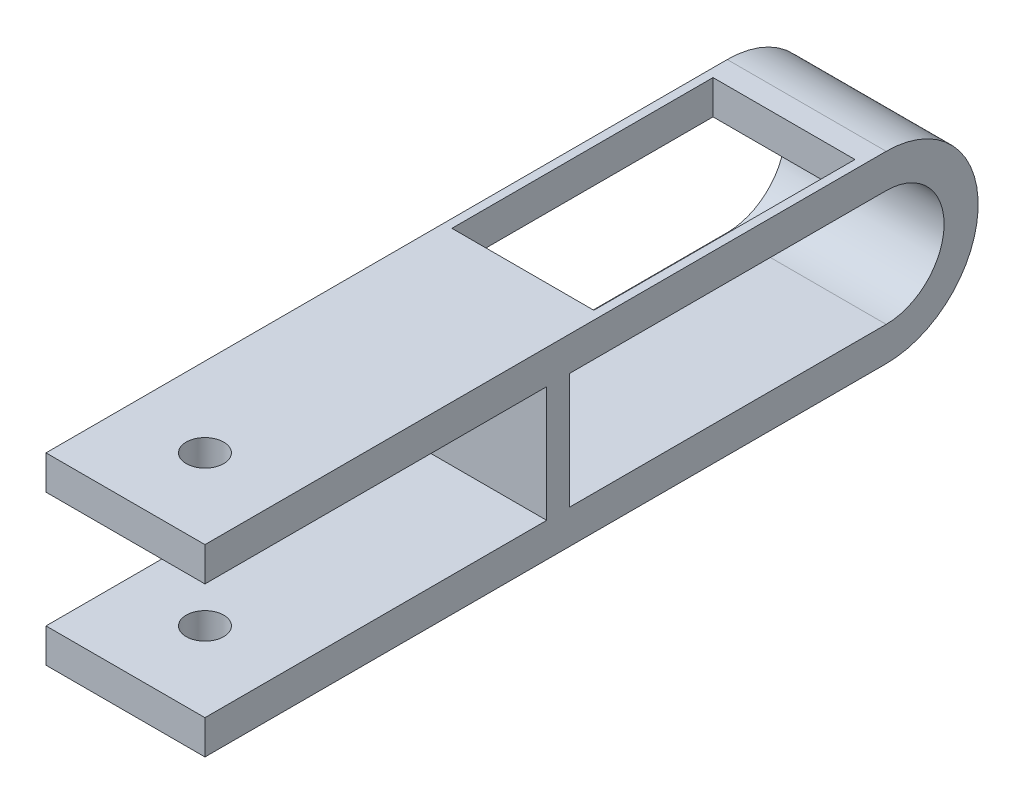
ISO-10303-21;
HEADER;
FILE_DESCRIPTION(('STEP AP214'),'2;1');
FILE_NAME('part.step','',(''),(''),'','','');
FILE_SCHEMA(('AUTOMOTIVE_DESIGN { 1 0 10303 214 1 1 1 1 }'));
ENDSEC;
DATA;
#1=APPLICATION_CONTEXT('core data for automotive mechanical design processes');
#2=APPLICATION_PROTOCOL_DEFINITION('international standard','automotive_design',2000,#1);
#3=PRODUCT_CONTEXT('',#1,'mechanical');
#4=PRODUCT('Part','Part','',(#3));
#5=PRODUCT_RELATED_PRODUCT_CATEGORY('part','',(#4));
#6=PRODUCT_DEFINITION_FORMATION('','',#4);
#7=PRODUCT_DEFINITION_CONTEXT('part definition',#1,'design');
#8=PRODUCT_DEFINITION('design','',#6,#7);
#9=PRODUCT_DEFINITION_SHAPE('','',#8);
#10=(LENGTH_UNIT() NAMED_UNIT(*) SI_UNIT(.MILLI.,.METRE.));
#11=(NAMED_UNIT(*) PLANE_ANGLE_UNIT() SI_UNIT($,.RADIAN.));
#12=(NAMED_UNIT(*) SI_UNIT($,.STERADIAN.) SOLID_ANGLE_UNIT());
#13=UNCERTAINTY_MEASURE_WITH_UNIT(LENGTH_MEASURE(1.E-05),#10,'distance_accuracy_value','');
#14=(GEOMETRIC_REPRESENTATION_CONTEXT(3) GLOBAL_UNCERTAINTY_ASSIGNED_CONTEXT((#13)) GLOBAL_UNIT_ASSIGNED_CONTEXT((#10,
#11,#12)) REPRESENTATION_CONTEXT('',''));
#15=CARTESIAN_POINT('',(0.,0.,0.));
#16=DIRECTION('',(0.,0.,1.));
#17=DIRECTION('',(1.,0.,0.));
#18=AXIS2_PLACEMENT_3D('',#15,#16,#17);
#19=CARTESIAN_POINT('',(14.,0.,-60.));
#20=DIRECTION('',(1.,0.,0.));
#21=DIRECTION('',(0.,0.,1.));
#22=AXIS2_PLACEMENT_3D('',#19,#20,#21);
#23=PLANE('',#22);
#24=CARTESIAN_POINT('',(14.,0.,-60.));
#25=DIRECTION('',(-1.,0.,0.));
#26=DIRECTION('',(0.,0.,1.));
#27=AXIS2_PLACEMENT_3D('',#24,#25,#26);
#28=CIRCLE('',#27,8.1);
#29=CARTESIAN_POINT('',(14.,8.1,-60.));
#30=VERTEX_POINT('',#29);
#31=CARTESIAN_POINT('',(14.,-8.1,-60.));
#32=VERTEX_POINT('',#31);
#33=EDGE_CURVE('E300',#30,#32,#28,.T.);
#34=ORIENTED_EDGE('',*,*,#33,.F.);
#35=DIRECTION('',(0.,0.,-1.));
#36=VECTOR('',#35,1.);
#37=CARTESIAN_POINT('',(14.,8.1,-60.));
#38=LINE('',#37,#36);
#39=CARTESIAN_POINT('',(14.,8.09999999999999,0.));
#40=VERTEX_POINT('',#39);
#41=EDGE_CURVE('E322',#40,#30,#38,.T.);
#42=ORIENTED_EDGE('',*,*,#41,.F.);
#43=DIRECTION('',(0.,1.,0.));
#44=VECTOR('',#43,1.);
#45=CARTESIAN_POINT('',(14.,8.09999999999999,0.));
#46=LINE('',#45,#44);
#47=CARTESIAN_POINT('',(14.,5.09999999999999,0.));
#48=VERTEX_POINT('',#47);
#49=EDGE_CURVE('E319',#48,#40,#46,.T.);
#50=ORIENTED_EDGE('',*,*,#49,.F.);
#51=DIRECTION('',(0.,0.,1.));
#52=VECTOR('',#51,1.);
#53=CARTESIAN_POINT('',(14.,5.1,-30.1));
#54=LINE('',#53,#52);
#55=CARTESIAN_POINT('',(14.,5.1,-30.1));
#56=VERTEX_POINT('',#55);
#57=EDGE_CURVE('E316',#56,#48,#54,.T.);
#58=ORIENTED_EDGE('',*,*,#57,.F.);
#59=DIRECTION('',(0.,1.,0.));
#60=VECTOR('',#59,1.);
#61=CARTESIAN_POINT('',(14.,-5.1,-30.1));
#62=LINE('',#61,#60);
#63=CARTESIAN_POINT('',(14.,-5.1,-30.1));
#64=VERTEX_POINT('',#63);
#65=EDGE_CURVE('E313',#64,#56,#62,.T.);
#66=ORIENTED_EDGE('',*,*,#65,.F.);
#67=DIRECTION('',(0.,0.,-1.));
#68=VECTOR('',#67,1.);
#69=CARTESIAN_POINT('',(14.,-5.1,-30.1));
#70=LINE('',#69,#68);
#71=CARTESIAN_POINT('',(14.,-5.09999999999999,0.));
#72=VERTEX_POINT('',#71);
#73=EDGE_CURVE('E310',#72,#64,#70,.T.);
#74=ORIENTED_EDGE('',*,*,#73,.F.);
#75=DIRECTION('',(0.,1.,0.));
#76=VECTOR('',#75,1.);
#77=CARTESIAN_POINT('',(14.,-8.09999999999999,0.));
#78=LINE('',#77,#76);
#79=CARTESIAN_POINT('',(14.,-8.09999999999999,0.));
#80=VERTEX_POINT('',#79);
#81=EDGE_CURVE('E307',#80,#72,#78,.T.);
#82=ORIENTED_EDGE('',*,*,#81,.F.);
#83=DIRECTION('',(0.,0.,1.));
#84=VECTOR('',#83,1.);
#85=CARTESIAN_POINT('',(14.,-8.1,-60.));
#86=LINE('',#85,#84);
#87=EDGE_CURVE('E303',#32,#80,#86,.T.);
#88=ORIENTED_EDGE('',*,*,#87,.F.);
#89=EDGE_LOOP('',(#34,#42,#50,#58,#66,#74,#82,#88));
#90=FACE_BOUND('',#89,.T.);
#91=DIRECTION('',(0.,0.,-1.));
#92=VECTOR('',#91,1.);
#93=CARTESIAN_POINT('',(14.,5.1,-60.));
#94=LINE('',#93,#92);
#95=CARTESIAN_POINT('',(14.,5.1,-32.1));
#96=VERTEX_POINT('',#95);
#97=CARTESIAN_POINT('',(14.,5.09999999999999,-60.));
#98=VERTEX_POINT('',#97);
#99=EDGE_CURVE('E271',#96,#98,#94,.T.);
#100=ORIENTED_EDGE('',*,*,#99,.T.);
#101=CARTESIAN_POINT('',(14.,0.,-60.));
#102=DIRECTION('',(-1.,0.,0.));
#103=DIRECTION('',(0.,0.,1.));
#104=AXIS2_PLACEMENT_3D('',#101,#102,#103);
#105=CIRCLE('',#104,5.1);
#106=CARTESIAN_POINT('',(14.,-5.1,-60.));
#107=VERTEX_POINT('',#106);
#108=EDGE_CURVE('E275',#98,#107,#105,.T.);
#109=ORIENTED_EDGE('',*,*,#108,.T.);
#110=DIRECTION('',(0.,0.,1.));
#111=VECTOR('',#110,1.);
#112=CARTESIAN_POINT('',(14.,-5.1,-60.));
#113=LINE('',#112,#111);
#114=CARTESIAN_POINT('',(14.,-5.1,-32.1));
#115=VERTEX_POINT('',#114);
#116=EDGE_CURVE('E278',#107,#115,#113,.T.);
#117=ORIENTED_EDGE('',*,*,#116,.T.);
#118=DIRECTION('',(0.,1.,0.));
#119=VECTOR('',#118,1.);
#120=CARTESIAN_POINT('',(14.,-5.1,-32.1));
#121=LINE('',#120,#119);
#122=EDGE_CURVE('E268',#115,#96,#121,.T.);
#123=ORIENTED_EDGE('',*,*,#122,.T.);
#124=EDGE_LOOP('',(#100,#109,#117,#123));
#125=FACE_BOUND('',#124,.T.);
#126=ADVANCED_FACE('F43',(#90,#125),#23,.T.);
#127=CARTESIAN_POINT('',(0.,0.,-60.));
#128=DIRECTION('',(1.,0.,0.));
#129=DIRECTION('',(0.,0.,1.));
#130=AXIS2_PLACEMENT_3D('',#127,#128,#129);
#131=PLANE('',#130);
#132=CARTESIAN_POINT('',(0.,0.,-60.));
#133=DIRECTION('',(-1.,0.,0.));
#134=DIRECTION('',(0.,0.,1.));
#135=AXIS2_PLACEMENT_3D('',#132,#133,#134);
#136=CIRCLE('',#135,8.1);
#137=CARTESIAN_POINT('',(0.,8.1,-60.));
#138=VERTEX_POINT('',#137);
#139=CARTESIAN_POINT('',(0.,-8.1,-60.));
#140=VERTEX_POINT('',#139);
#141=EDGE_CURVE('E299',#138,#140,#136,.T.);
#142=ORIENTED_EDGE('',*,*,#141,.T.);
#143=DIRECTION('',(0.,0.,1.));
#144=VECTOR('',#143,1.);
#145=CARTESIAN_POINT('',(0.,-8.1,-60.));
#146=LINE('',#145,#144);
#147=CARTESIAN_POINT('',(0.,-8.09999999999999,0.));
#148=VERTEX_POINT('',#147);
#149=EDGE_CURVE('E328',#140,#148,#146,.T.);
#150=ORIENTED_EDGE('',*,*,#149,.T.);
#151=DIRECTION('',(0.,1.,0.));
#152=VECTOR('',#151,1.);
#153=CARTESIAN_POINT('',(0.,-8.09999999999999,0.));
#154=LINE('',#153,#152);
#155=CARTESIAN_POINT('',(0.,-5.09999999999999,0.));
#156=VERTEX_POINT('',#155);
#157=EDGE_CURVE('E331',#148,#156,#154,.T.);
#158=ORIENTED_EDGE('',*,*,#157,.T.);
#159=DIRECTION('',(0.,0.,-1.));
#160=VECTOR('',#159,1.);
#161=CARTESIAN_POINT('',(0.,-5.1,-30.1));
#162=LINE('',#161,#160);
#163=CARTESIAN_POINT('',(0.,-5.1,-30.1));
#164=VERTEX_POINT('',#163);
#165=EDGE_CURVE('E334',#156,#164,#162,.T.);
#166=ORIENTED_EDGE('',*,*,#165,.T.);
#167=DIRECTION('',(0.,1.,0.));
#168=VECTOR('',#167,1.);
#169=CARTESIAN_POINT('',(0.,-5.1,-30.1));
#170=LINE('',#169,#168);
#171=CARTESIAN_POINT('',(0.,5.1,-30.1));
#172=VERTEX_POINT('',#171);
#173=EDGE_CURVE('E337',#164,#172,#170,.T.);
#174=ORIENTED_EDGE('',*,*,#173,.T.);
#175=DIRECTION('',(0.,0.,1.));
#176=VECTOR('',#175,1.);
#177=CARTESIAN_POINT('',(0.,5.1,-30.1));
#178=LINE('',#177,#176);
#179=CARTESIAN_POINT('',(0.,5.09999999999999,0.));
#180=VERTEX_POINT('',#179);
#181=EDGE_CURVE('E340',#172,#180,#178,.T.);
#182=ORIENTED_EDGE('',*,*,#181,.T.);
#183=DIRECTION('',(0.,1.,0.));
#184=VECTOR('',#183,1.);
#185=CARTESIAN_POINT('',(0.,8.09999999999999,0.));
#186=LINE('',#185,#184);
#187=CARTESIAN_POINT('',(0.,8.09999999999999,0.));
#188=VERTEX_POINT('',#187);
#189=EDGE_CURVE('E343',#180,#188,#186,.T.);
#190=ORIENTED_EDGE('',*,*,#189,.T.);
#191=DIRECTION('',(0.,0.,-1.));
#192=VECTOR('',#191,1.);
#193=CARTESIAN_POINT('',(0.,8.1,-60.));
#194=LINE('',#193,#192);
#195=EDGE_CURVE('E304',#188,#138,#194,.T.);
#196=ORIENTED_EDGE('',*,*,#195,.T.);
#197=EDGE_LOOP('',(#142,#150,#158,#166,#174,#182,#190,#196));
#198=FACE_BOUND('',#197,.T.);
#199=DIRECTION('',(0.,1.,0.));
#200=VECTOR('',#199,1.);
#201=CARTESIAN_POINT('',(0.,-5.1,-32.1));
#202=LINE('',#201,#200);
#203=CARTESIAN_POINT('',(0.,-5.1,-32.1));
#204=VERTEX_POINT('',#203);
#205=CARTESIAN_POINT('',(0.,5.1,-32.1));
#206=VERTEX_POINT('',#205);
#207=EDGE_CURVE('E267',#204,#206,#202,.T.);
#208=ORIENTED_EDGE('',*,*,#207,.F.);
#209=DIRECTION('',(0.,0.,1.));
#210=VECTOR('',#209,1.);
#211=CARTESIAN_POINT('',(0.,-5.1,-60.));
#212=LINE('',#211,#210);
#213=CARTESIAN_POINT('',(0.,-5.1,-60.));
#214=VERTEX_POINT('',#213);
#215=EDGE_CURVE('E272',#214,#204,#212,.T.);
#216=ORIENTED_EDGE('',*,*,#215,.F.);
#217=CARTESIAN_POINT('',(0.,0.,-60.));
#218=DIRECTION('',(-1.,0.,0.));
#219=DIRECTION('',(0.,0.,1.));
#220=AXIS2_PLACEMENT_3D('',#217,#218,#219);
#221=CIRCLE('',#220,5.1);
#222=CARTESIAN_POINT('',(0.,5.09999999999999,-60.));
#223=VERTEX_POINT('',#222);
#224=EDGE_CURVE('E287',#223,#214,#221,.T.);
#225=ORIENTED_EDGE('',*,*,#224,.F.);
#226=DIRECTION('',(0.,0.,-1.));
#227=VECTOR('',#226,1.);
#228=CARTESIAN_POINT('',(0.,5.1,-60.));
#229=LINE('',#228,#227);
#230=EDGE_CURVE('E284',#206,#223,#229,.T.);
#231=ORIENTED_EDGE('',*,*,#230,.F.);
#232=EDGE_LOOP('',(#208,#216,#225,#231));
#233=FACE_BOUND('',#232,.T.);
#234=ADVANCED_FACE('F369',(#198,#233),#131,.F.);
#235=CARTESIAN_POINT('',(14.,0.,-60.));
#236=DIRECTION('',(-1.,0.,0.));
#237=DIRECTION('',(0.,0.,-1.));
#238=AXIS2_PLACEMENT_3D('',#235,#236,#237);
#239=CYLINDRICAL_SURFACE('',#238,8.1);
#240=ORIENTED_EDGE('',*,*,#141,.F.);
#241=DIRECTION('',(-1.,0.,0.));
#242=VECTOR('',#241,1.);
#243=CARTESIAN_POINT('',(14.,8.1,-60.));
#244=LINE('',#243,#242);
#245=EDGE_CURVE('E325',#30,#138,#244,.T.);
#246=ORIENTED_EDGE('',*,*,#245,.F.);
#247=ORIENTED_EDGE('',*,*,#33,.T.);
#248=DIRECTION('',(-1.,0.,0.));
#249=VECTOR('',#248,1.);
#250=CARTESIAN_POINT('',(14.,-8.1,-60.));
#251=LINE('',#250,#249);
#252=EDGE_CURVE('E11',#32,#140,#251,.T.);
#253=ORIENTED_EDGE('',*,*,#252,.T.);
#254=EDGE_LOOP('',(#240,#246,#247,#253));
#255=FACE_BOUND('',#254,.T.);
#256=ADVANCED_FACE('F45',(#255),#239,.T.);
#257=CARTESIAN_POINT('',(14.,-8.1,-60.));
#258=DIRECTION('',(0.,1.,0.));
#259=DIRECTION('',(0.,0.,-1.));
#260=AXIS2_PLACEMENT_3D('',#257,#258,#259);
#261=PLANE('',#260);
#262=CARTESIAN_POINT('',(7.,-8.1,-38.));
#263=DIRECTION('',(0.,1.,0.));
#264=DIRECTION('',(0.,0.,1.));
#265=AXIS2_PLACEMENT_3D('',#262,#263,#264);
#266=CIRCLE('',#265,2.35);
#267=CARTESIAN_POINT('',(4.65,-8.1,-38.));
#268=VERTEX_POINT('',#267);
#269=CARTESIAN_POINT('',(9.35,-8.1,-38.));
#270=VERTEX_POINT('',#269);
#271=EDGE_CURVE('E243',#268,#270,#266,.T.);
#272=ORIENTED_EDGE('',*,*,#271,.T.);
#273=DIRECTION('',(0.0830454798537398,0.,-0.99654575824488));
#274=VECTOR('',#273,1.);
#275=CARTESIAN_POINT('',(6.14068965517242,-8.09999999999999,0.511724137931035));
#276=LINE('',#275,#274);
#277=CARTESIAN_POINT('',(10.6,-8.1,-53.));
#278=VERTEX_POINT('',#277);
#279=EDGE_CURVE('E246',#270,#278,#276,.T.);
#280=ORIENTED_EDGE('',*,*,#279,.T.);
#281=CARTESIAN_POINT('',(7.,-8.1,-53.));
#282=DIRECTION('',(0.,1.,0.));
#283=DIRECTION('',(0.,0.,1.));
#284=AXIS2_PLACEMENT_3D('',#281,#282,#283);
#285=CIRCLE('',#284,3.6);
#286=CARTESIAN_POINT('',(3.4,-8.1,-53.));
#287=VERTEX_POINT('',#286);
#288=EDGE_CURVE('E234',#278,#287,#285,.T.);
#289=ORIENTED_EDGE('',*,*,#288,.T.);
#290=DIRECTION('',(0.0830454798537401,0.,0.99654575824488));
#291=VECTOR('',#290,1.);
#292=CARTESIAN_POINT('',(7.76275862068966,-8.09999999999999,-0.646896551724138));
#293=LINE('',#292,#291);
#294=EDGE_CURVE('E227',#287,#268,#293,.T.);
#295=ORIENTED_EDGE('',*,*,#294,.T.);
#296=EDGE_LOOP('',(#272,#280,#289,#295));
#297=FACE_BOUND('',#296,.T.);
#298=CARTESIAN_POINT('',(7.,-8.09999999999999,-7.));
#299=DIRECTION('',(0.,1.,0.));
#300=DIRECTION('',(0.,0.,1.));
#301=AXIS2_PLACEMENT_3D('',#298,#299,#300);
#302=CIRCLE('',#301,1.65);
#303=CARTESIAN_POINT('',(7.,-8.09999999999999,-5.35));
#304=VERTEX_POINT('',#303);
#305=EDGE_CURVE('E253',#304,#304,#302,.T.);
#306=ORIENTED_EDGE('',*,*,#305,.T.);
#307=EDGE_LOOP('',(#306));
#308=FACE_BOUND('',#307,.T.);
#309=ORIENTED_EDGE('',*,*,#149,.F.);
#310=ORIENTED_EDGE('',*,*,#252,.F.);
#311=ORIENTED_EDGE('',*,*,#87,.T.);
#312=DIRECTION('',(-1.,0.,0.));
#313=VECTOR('',#312,1.);
#314=CARTESIAN_POINT('',(14.,-8.09999999999999,0.));
#315=LINE('',#314,#313);
#316=EDGE_CURVE('E52',#80,#148,#315,.T.);
#317=ORIENTED_EDGE('',*,*,#316,.T.);
#318=EDGE_LOOP('',(#309,#310,#311,#317));
#319=FACE_BOUND('',#318,.T.);
#320=ADVANCED_FACE('F362',(#297,#308,#319),#261,.F.);
#321=CARTESIAN_POINT('',(14.,-8.09999999999999,0.));
#322=DIRECTION('',(0.,0.,-1.));
#323=DIRECTION('',(1.,0.,0.));
#324=AXIS2_PLACEMENT_3D('',#321,#322,#323);
#325=PLANE('',#324);
#326=ORIENTED_EDGE('',*,*,#157,.F.);
#327=ORIENTED_EDGE('',*,*,#316,.F.);
#328=ORIENTED_EDGE('',*,*,#81,.T.);
#329=DIRECTION('',(-1.,0.,0.));
#330=VECTOR('',#329,1.);
#331=CARTESIAN_POINT('',(14.,-5.09999999999999,0.));
#332=LINE('',#331,#330);
#333=EDGE_CURVE('E357',#72,#156,#332,.T.);
#334=ORIENTED_EDGE('',*,*,#333,.T.);
#335=EDGE_LOOP('',(#326,#327,#328,#334));
#336=FACE_BOUND('',#335,.T.);
#337=ADVANCED_FACE('F366',(#336),#325,.F.);
#338=CARTESIAN_POINT('',(14.,-5.1,-30.1));
#339=DIRECTION('',(0.,-1.,0.));
#340=DIRECTION('',(0.,0.,1.));
#341=AXIS2_PLACEMENT_3D('',#338,#339,#340);
#342=PLANE('',#341);
#343=CARTESIAN_POINT('',(7.,-5.09999999999999,-7.));
#344=DIRECTION('',(0.,1.,0.));
#345=DIRECTION('',(0.,0.,1.));
#346=AXIS2_PLACEMENT_3D('',#343,#344,#345);
#347=CIRCLE('',#346,1.65);
#348=CARTESIAN_POINT('',(7.,-5.09999999999999,-5.35));
#349=VERTEX_POINT('',#348);
#350=EDGE_CURVE('E264',#349,#349,#347,.T.);
#351=ORIENTED_EDGE('',*,*,#350,.F.);
#352=EDGE_LOOP('',(#351));
#353=FACE_BOUND('',#352,.T.);
#354=ORIENTED_EDGE('',*,*,#165,.F.);
#355=ORIENTED_EDGE('',*,*,#333,.F.);
#356=ORIENTED_EDGE('',*,*,#73,.T.);
#357=DIRECTION('',(-1.,0.,0.));
#358=VECTOR('',#357,1.);
#359=CARTESIAN_POINT('',(14.,-5.1,-30.1));
#360=LINE('',#359,#358);
#361=EDGE_CURVE('E355',#64,#164,#360,.T.);
#362=ORIENTED_EDGE('',*,*,#361,.T.);
#363=EDGE_LOOP('',(#354,#355,#356,#362));
#364=FACE_BOUND('',#363,.T.);
#365=ADVANCED_FACE('F382',(#353,#364),#342,.F.);
#366=CARTESIAN_POINT('',(14.,-5.1,-30.1));
#367=DIRECTION('',(0.,0.,-1.));
#368=DIRECTION('',(1.,0.,0.));
#369=AXIS2_PLACEMENT_3D('',#366,#367,#368);
#370=PLANE('',#369);
#371=ORIENTED_EDGE('',*,*,#173,.F.);
#372=ORIENTED_EDGE('',*,*,#361,.F.);
#373=ORIENTED_EDGE('',*,*,#65,.T.);
#374=DIRECTION('',(-1.,0.,0.));
#375=VECTOR('',#374,1.);
#376=CARTESIAN_POINT('',(14.,5.1,-30.1));
#377=LINE('',#376,#375);
#378=EDGE_CURVE('E353',#56,#172,#377,.T.);
#379=ORIENTED_EDGE('',*,*,#378,.T.);
#380=EDGE_LOOP('',(#371,#372,#373,#379));
#381=FACE_BOUND('',#380,.T.);
#382=ADVANCED_FACE('F386',(#381),#370,.F.);
#383=CARTESIAN_POINT('',(14.,5.1,-30.1));
#384=DIRECTION('',(0.,1.,0.));
#385=DIRECTION('',(0.,0.,-1.));
#386=AXIS2_PLACEMENT_3D('',#383,#384,#385);
#387=PLANE('',#386);
#388=CARTESIAN_POINT('',(7.,5.09999999999999,-7.));
#389=DIRECTION('',(0.,-1.,0.));
#390=DIRECTION('',(0.,0.,-1.));
#391=AXIS2_PLACEMENT_3D('',#388,#389,#390);
#392=CIRCLE('',#391,1.65);
#393=CARTESIAN_POINT('',(7.,5.09999999999999,-8.65));
#394=VERTEX_POINT('',#393);
#395=EDGE_CURVE('E261',#394,#394,#392,.T.);
#396=ORIENTED_EDGE('',*,*,#395,.F.);
#397=EDGE_LOOP('',(#396));
#398=FACE_BOUND('',#397,.T.);
#399=ORIENTED_EDGE('',*,*,#181,.F.);
#400=ORIENTED_EDGE('',*,*,#378,.F.);
#401=ORIENTED_EDGE('',*,*,#57,.T.);
#402=DIRECTION('',(-1.,0.,0.));
#403=VECTOR('',#402,1.);
#404=CARTESIAN_POINT('',(14.,5.09999999999999,0.));
#405=LINE('',#404,#403);
#406=EDGE_CURVE('E351',#48,#180,#405,.T.);
#407=ORIENTED_EDGE('',*,*,#406,.T.);
#408=EDGE_LOOP('',(#399,#400,#401,#407));
#409=FACE_BOUND('',#408,.T.);
#410=ADVANCED_FACE('F388',(#398,#409),#387,.F.);
#411=CARTESIAN_POINT('',(14.,8.09999999999999,0.));
#412=DIRECTION('',(0.,0.,-1.));
#413=DIRECTION('',(1.,0.,0.));
#414=AXIS2_PLACEMENT_3D('',#411,#412,#413);
#415=PLANE('',#414);
#416=ORIENTED_EDGE('',*,*,#189,.F.);
#417=ORIENTED_EDGE('',*,*,#406,.F.);
#418=ORIENTED_EDGE('',*,*,#49,.T.);
#419=DIRECTION('',(-1.,0.,0.));
#420=VECTOR('',#419,1.);
#421=CARTESIAN_POINT('',(14.,8.09999999999999,0.));
#422=LINE('',#421,#420);
#423=EDGE_CURVE('E349',#40,#188,#422,.T.);
#424=ORIENTED_EDGE('',*,*,#423,.T.);
#425=EDGE_LOOP('',(#416,#417,#418,#424));
#426=FACE_BOUND('',#425,.T.);
#427=ADVANCED_FACE('F392',(#426),#415,.F.);
#428=CARTESIAN_POINT('',(14.,8.1,-60.));
#429=DIRECTION('',(0.,-1.,0.));
#430=DIRECTION('',(0.,0.,1.));
#431=AXIS2_PLACEMENT_3D('',#428,#429,#430);
#432=PLANE('',#431);
#433=DIRECTION('',(-1.,0.,0.));
#434=VECTOR('',#433,1.);
#435=CARTESIAN_POINT('',(0.749999999999999,8.1,-35.));
#436=LINE('',#435,#434);
#437=CARTESIAN_POINT('',(13.25,8.1,-35.));
#438=VERTEX_POINT('',#437);
#439=CARTESIAN_POINT('',(0.749999999999999,8.1,-35.));
#440=VERTEX_POINT('',#439);
#441=EDGE_CURVE('E186',#438,#440,#436,.T.);
#442=ORIENTED_EDGE('',*,*,#441,.T.);
#443=DIRECTION('',(0.,0.,-1.));
#444=VECTOR('',#443,1.);
#445=CARTESIAN_POINT('',(0.749999999999999,8.1,-35.));
#446=LINE('',#445,#444);
#447=CARTESIAN_POINT('',(0.749999999999999,8.1,-58.));
#448=VERTEX_POINT('',#447);
#449=EDGE_CURVE('E209',#440,#448,#446,.T.);
#450=ORIENTED_EDGE('',*,*,#449,.T.);
#451=DIRECTION('',(1.,0.,0.));
#452=VECTOR('',#451,1.);
#453=CARTESIAN_POINT('',(0.749999999999999,8.1,-58.));
#454=LINE('',#453,#452);
#455=CARTESIAN_POINT('',(13.25,8.1,-58.));
#456=VERTEX_POINT('',#455);
#457=EDGE_CURVE('E187',#448,#456,#454,.T.);
#458=ORIENTED_EDGE('',*,*,#457,.T.);
#459=DIRECTION('',(0.,0.,1.));
#460=VECTOR('',#459,1.);
#461=CARTESIAN_POINT('',(13.25,8.1,-35.));
#462=LINE('',#461,#460);
#463=EDGE_CURVE('E201',#456,#438,#462,.T.);
#464=ORIENTED_EDGE('',*,*,#463,.T.);
#465=EDGE_LOOP('',(#442,#450,#458,#464));
#466=FACE_BOUND('',#465,.T.);
#467=CARTESIAN_POINT('',(7.,8.09999999999999,-7.));
#468=DIRECTION('',(0.,1.,0.));
#469=DIRECTION('',(0.,0.,1.));
#470=AXIS2_PLACEMENT_3D('',#467,#468,#469);
#471=CIRCLE('',#470,1.65);
#472=CARTESIAN_POINT('',(7.,8.09999999999999,-5.35));
#473=VERTEX_POINT('',#472);
#474=EDGE_CURVE('E47',#473,#473,#471,.T.);
#475=ORIENTED_EDGE('',*,*,#474,.F.);
#476=EDGE_LOOP('',(#475));
#477=FACE_BOUND('',#476,.T.);
#478=ORIENTED_EDGE('',*,*,#195,.F.);
#479=ORIENTED_EDGE('',*,*,#423,.F.);
#480=ORIENTED_EDGE('',*,*,#41,.T.);
#481=ORIENTED_EDGE('',*,*,#245,.T.);
#482=EDGE_LOOP('',(#478,#479,#480,#481));
#483=FACE_BOUND('',#482,.T.);
#484=ADVANCED_FACE('F394',(#466,#477,#483),#432,.F.);
#485=CARTESIAN_POINT('',(14.,-5.1,-32.1));
#486=DIRECTION('',(0.,0.,-1.));
#487=DIRECTION('',(1.,0.,0.));
#488=AXIS2_PLACEMENT_3D('',#485,#486,#487);
#489=PLANE('',#488);
#490=ORIENTED_EDGE('',*,*,#207,.T.);
#491=DIRECTION('',(-1.,0.,0.));
#492=VECTOR('',#491,1.);
#493=CARTESIAN_POINT('',(14.,5.1,-32.1));
#494=LINE('',#493,#492);
#495=EDGE_CURVE('E297',#96,#206,#494,.T.);
#496=ORIENTED_EDGE('',*,*,#495,.F.);
#497=ORIENTED_EDGE('',*,*,#122,.F.);
#498=DIRECTION('',(-1.,0.,0.));
#499=VECTOR('',#498,1.);
#500=CARTESIAN_POINT('',(14.,-5.1,-32.1));
#501=LINE('',#500,#499);
#502=EDGE_CURVE('E281',#115,#204,#501,.T.);
#503=ORIENTED_EDGE('',*,*,#502,.T.);
#504=EDGE_LOOP('',(#490,#496,#497,#503));
#505=FACE_BOUND('',#504,.T.);
#506=ADVANCED_FACE('F396',(#505),#489,.T.);
#507=CARTESIAN_POINT('',(14.,5.1,-60.));
#508=DIRECTION('',(0.,-1.,0.));
#509=DIRECTION('',(0.,0.,1.));
#510=AXIS2_PLACEMENT_3D('',#507,#508,#509);
#511=PLANE('',#510);
#512=DIRECTION('',(0.,0.,1.));
#513=VECTOR('',#512,1.);
#514=CARTESIAN_POINT('',(13.25,5.1,-35.));
#515=LINE('',#514,#513);
#516=CARTESIAN_POINT('',(13.25,5.1,-58.));
#517=VERTEX_POINT('',#516);
#518=CARTESIAN_POINT('',(13.25,5.1,-35.));
#519=VERTEX_POINT('',#518);
#520=EDGE_CURVE('E194',#517,#519,#515,.T.);
#521=ORIENTED_EDGE('',*,*,#520,.F.);
#522=DIRECTION('',(1.,0.,0.));
#523=VECTOR('',#522,1.);
#524=CARTESIAN_POINT('',(0.749999999999999,5.1,-58.));
#525=LINE('',#524,#523);
#526=CARTESIAN_POINT('',(0.749999999999999,5.1,-58.));
#527=VERTEX_POINT('',#526);
#528=EDGE_CURVE('E202',#527,#517,#525,.T.);
#529=ORIENTED_EDGE('',*,*,#528,.F.);
#530=DIRECTION('',(0.,0.,-1.));
#531=VECTOR('',#530,1.);
#532=CARTESIAN_POINT('',(0.749999999999999,5.1,-35.));
#533=LINE('',#532,#531);
#534=CARTESIAN_POINT('',(0.749999999999999,5.1,-35.));
#535=VERTEX_POINT('',#534);
#536=EDGE_CURVE('E195',#535,#527,#533,.T.);
#537=ORIENTED_EDGE('',*,*,#536,.F.);
#538=DIRECTION('',(-1.,0.,0.));
#539=VECTOR('',#538,1.);
#540=CARTESIAN_POINT('',(0.749999999999999,5.1,-35.));
#541=LINE('',#540,#539);
#542=EDGE_CURVE('E183',#519,#535,#541,.T.);
#543=ORIENTED_EDGE('',*,*,#542,.F.);
#544=EDGE_LOOP('',(#521,#529,#537,#543));
#545=FACE_BOUND('',#544,.T.);
#546=ORIENTED_EDGE('',*,*,#230,.T.);
#547=DIRECTION('',(-1.,0.,0.));
#548=VECTOR('',#547,1.);
#549=CARTESIAN_POINT('',(14.,5.09999999999999,-60.));
#550=LINE('',#549,#548);
#551=EDGE_CURVE('E295',#98,#223,#550,.T.);
#552=ORIENTED_EDGE('',*,*,#551,.F.);
#553=ORIENTED_EDGE('',*,*,#99,.F.);
#554=ORIENTED_EDGE('',*,*,#495,.T.);
#555=EDGE_LOOP('',(#546,#552,#553,#554));
#556=FACE_BOUND('',#555,.T.);
#557=ADVANCED_FACE('F191',(#545,#556),#511,.T.);
#558=CARTESIAN_POINT('',(14.,0.,-60.));
#559=DIRECTION('',(-1.,0.,0.));
#560=DIRECTION('',(0.,0.,-1.));
#561=AXIS2_PLACEMENT_3D('',#558,#559,#560);
#562=CYLINDRICAL_SURFACE('',#561,5.1);
#563=ORIENTED_EDGE('',*,*,#224,.T.);
#564=DIRECTION('',(-1.,0.,0.));
#565=VECTOR('',#564,1.);
#566=CARTESIAN_POINT('',(14.,-5.1,-60.));
#567=LINE('',#566,#565);
#568=EDGE_CURVE('E293',#107,#214,#567,.T.);
#569=ORIENTED_EDGE('',*,*,#568,.F.);
#570=ORIENTED_EDGE('',*,*,#108,.F.);
#571=ORIENTED_EDGE('',*,*,#551,.T.);
#572=EDGE_LOOP('',(#563,#569,#570,#571));
#573=FACE_BOUND('',#572,.T.);
#574=ADVANCED_FACE('F416',(#573),#562,.F.);
#575=CARTESIAN_POINT('',(14.,-5.1,-60.));
#576=DIRECTION('',(0.,1.,0.));
#577=DIRECTION('',(0.,0.,-1.));
#578=AXIS2_PLACEMENT_3D('',#575,#576,#577);
#579=PLANE('',#578);
#580=ORIENTED_EDGE('',*,*,#215,.T.);
#581=ORIENTED_EDGE('',*,*,#502,.F.);
#582=ORIENTED_EDGE('',*,*,#116,.F.);
#583=ORIENTED_EDGE('',*,*,#568,.T.);
#584=EDGE_LOOP('',(#580,#581,#582,#583));
#585=FACE_BOUND('',#584,.T.);
#586=ADVANCED_FACE('F419',(#585),#579,.T.);
#587=CARTESIAN_POINT('',(7.,31.9,-7.));
#588=DIRECTION('',(0.,-1.,0.));
#589=DIRECTION('',(0.,0.,1.));
#590=AXIS2_PLACEMENT_3D('',#587,#588,#589);
#591=CYLINDRICAL_SURFACE('',#590,1.65);
#592=ORIENTED_EDGE('',*,*,#474,.T.);
#593=EDGE_LOOP('',(#592));
#594=FACE_BOUND('',#593,.T.);
#595=ORIENTED_EDGE('',*,*,#395,.T.);
#596=EDGE_LOOP('',(#595));
#597=FACE_BOUND('',#596,.T.);
#598=ADVANCED_FACE('F423',(#594,#597),#591,.F.);
#599=ORIENTED_EDGE('',*,*,#305,.F.);
#600=EDGE_LOOP('',(#599));
#601=FACE_BOUND('',#600,.T.);
#602=ORIENTED_EDGE('',*,*,#350,.T.);
#603=EDGE_LOOP('',(#602));
#604=FACE_BOUND('',#603,.T.);
#605=ADVANCED_FACE('F425',(#601,#604),#591,.F.);
#606=CARTESIAN_POINT('',(7.76275862068966,-6.59999999999999,-0.646896551724138));
#607=DIRECTION('',(-0.996545758244879,0.,0.08304547985374));
#608=DIRECTION('',(-0.0830454798537401,0.,-0.99654575824488));
#609=AXIS2_PLACEMENT_3D('',#606,#607,#608);
#610=PLANE('',#609);
#611=ORIENTED_EDGE('',*,*,#294,.F.);
#612=DIRECTION('',(0.,-1.,0.));
#613=VECTOR('',#612,1.);
#614=CARTESIAN_POINT('',(3.4,-6.6,-53.));
#615=LINE('',#614,#613);
#616=CARTESIAN_POINT('',(3.4,-6.6,-53.));
#617=VERTEX_POINT('',#616);
#618=EDGE_CURVE('E251',#617,#287,#615,.T.);
#619=ORIENTED_EDGE('',*,*,#618,.F.);
#620=DIRECTION('',(0.0830454798537401,0.,0.99654575824488));
#621=VECTOR('',#620,1.);
#622=CARTESIAN_POINT('',(7.76275862068966,-6.59999999999999,-0.646896551724138));
#623=LINE('',#622,#621);
#624=CARTESIAN_POINT('',(4.65,-6.6,-38.));
#625=VERTEX_POINT('',#624);
#626=EDGE_CURVE('E230',#617,#625,#623,.T.);
#627=ORIENTED_EDGE('',*,*,#626,.T.);
#628=DIRECTION('',(0.,-1.,0.));
#629=VECTOR('',#628,1.);
#630=CARTESIAN_POINT('',(4.65,-6.6,-38.));
#631=LINE('',#630,#629);
#632=EDGE_CURVE('E240',#625,#268,#631,.T.);
#633=ORIENTED_EDGE('',*,*,#632,.T.);
#634=EDGE_LOOP('',(#611,#619,#627,#633));
#635=FACE_BOUND('',#634,.T.);
#636=ADVANCED_FACE('F428',(#635),#610,.F.);
#637=CARTESIAN_POINT('',(7.,-6.6,-53.));
#638=DIRECTION('',(0.,-1.,0.));
#639=DIRECTION('',(0.,0.,1.));
#640=AXIS2_PLACEMENT_3D('',#637,#638,#639);
#641=CYLINDRICAL_SURFACE('',#640,3.6);
#642=ORIENTED_EDGE('',*,*,#288,.F.);
#643=DIRECTION('',(0.,-1.,0.));
#644=VECTOR('',#643,1.);
#645=CARTESIAN_POINT('',(10.6,-6.6,-53.));
#646=LINE('',#645,#644);
#647=CARTESIAN_POINT('',(10.6,-6.6,-53.));
#648=VERTEX_POINT('',#647);
#649=EDGE_CURVE('E254',#648,#278,#646,.T.);
#650=ORIENTED_EDGE('',*,*,#649,.F.);
#651=CARTESIAN_POINT('',(7.,-6.6,-53.));
#652=DIRECTION('',(0.,1.,0.));
#653=DIRECTION('',(0.,0.,1.));
#654=AXIS2_PLACEMENT_3D('',#651,#652,#653);
#655=CIRCLE('',#654,3.6);
#656=EDGE_CURVE('E238',#648,#617,#655,.T.);
#657=ORIENTED_EDGE('',*,*,#656,.T.);
#658=ORIENTED_EDGE('',*,*,#618,.T.);
#659=EDGE_LOOP('',(#642,#650,#657,#658));
#660=FACE_BOUND('',#659,.T.);
#661=ADVANCED_FACE('F432',(#660),#641,.F.);
#662=CARTESIAN_POINT('',(6.14068965517242,-6.59999999999999,0.511724137931035));
#663=DIRECTION('',(0.99654575824488,0.,0.0830454798537398));
#664=DIRECTION('',(-0.0830454798537398,0.,0.99654575824488));
#665=AXIS2_PLACEMENT_3D('',#662,#663,#664);
#666=PLANE('',#665);
#667=ORIENTED_EDGE('',*,*,#279,.F.);
#668=DIRECTION('',(0.,-1.,0.));
#669=VECTOR('',#668,1.);
#670=CARTESIAN_POINT('',(9.35,-6.6,-38.));
#671=LINE('',#670,#669);
#672=CARTESIAN_POINT('',(9.35,-6.6,-38.));
#673=VERTEX_POINT('',#672);
#674=EDGE_CURVE('E256',#673,#270,#671,.T.);
#675=ORIENTED_EDGE('',*,*,#674,.F.);
#676=DIRECTION('',(0.0830454798537398,0.,-0.99654575824488));
#677=VECTOR('',#676,1.);
#678=CARTESIAN_POINT('',(6.14068965517242,-6.59999999999999,0.511724137931035));
#679=LINE('',#678,#677);
#680=EDGE_CURVE('E236',#673,#648,#679,.T.);
#681=ORIENTED_EDGE('',*,*,#680,.T.);
#682=ORIENTED_EDGE('',*,*,#649,.T.);
#683=EDGE_LOOP('',(#667,#675,#681,#682));
#684=FACE_BOUND('',#683,.T.);
#685=ADVANCED_FACE('F438',(#684),#666,.F.);
#686=CARTESIAN_POINT('',(7.,-6.6,-38.));
#687=DIRECTION('',(0.,-1.,0.));
#688=DIRECTION('',(0.,0.,1.));
#689=AXIS2_PLACEMENT_3D('',#686,#687,#688);
#690=CYLINDRICAL_SURFACE('',#689,2.35);
#691=ORIENTED_EDGE('',*,*,#271,.F.);
#692=ORIENTED_EDGE('',*,*,#632,.F.);
#693=CARTESIAN_POINT('',(7.,-6.6,-38.));
#694=DIRECTION('',(0.,1.,0.));
#695=DIRECTION('',(0.,0.,1.));
#696=AXIS2_PLACEMENT_3D('',#693,#694,#695);
#697=CIRCLE('',#696,2.35);
#698=EDGE_CURVE('E233',#625,#673,#697,.T.);
#699=ORIENTED_EDGE('',*,*,#698,.T.);
#700=ORIENTED_EDGE('',*,*,#674,.T.);
#701=EDGE_LOOP('',(#691,#692,#699,#700));
#702=FACE_BOUND('',#701,.T.);
#703=ADVANCED_FACE('F434',(#702),#690,.F.);
#704=CARTESIAN_POINT('',(0.,-6.59999999999999,0.));
#705=DIRECTION('',(0.,-1.,0.));
#706=DIRECTION('',(0.,0.,1.));
#707=AXIS2_PLACEMENT_3D('',#704,#705,#706);
#708=PLANE('',#707);
#709=CARTESIAN_POINT('',(7.,-6.6,-53.));
#710=DIRECTION('',(0.,1.,0.));
#711=DIRECTION('',(0.,0.,1.));
#712=AXIS2_PLACEMENT_3D('',#709,#710,#711);
#713=CIRCLE('',#712,0.149999999999998);
#714=CARTESIAN_POINT('',(7.,-6.6,-52.85));
#715=VERTEX_POINT('',#714);
#716=EDGE_CURVE('E196',#715,#715,#713,.T.);
#717=ORIENTED_EDGE('',*,*,#716,.T.);
#718=EDGE_LOOP('',(#717));
#719=FACE_BOUND('',#718,.T.);
#720=CARTESIAN_POINT('',(7.,-6.6,-38.));
#721=DIRECTION('',(0.,1.,0.));
#722=DIRECTION('',(0.,0.,1.));
#723=AXIS2_PLACEMENT_3D('',#720,#721,#722);
#724=CIRCLE('',#723,0.149999999999998);
#725=CARTESIAN_POINT('',(7.,-6.6,-37.85));
#726=VERTEX_POINT('',#725);
#727=EDGE_CURVE('E221',#726,#726,#724,.T.);
#728=ORIENTED_EDGE('',*,*,#727,.T.);
#729=EDGE_LOOP('',(#728));
#730=FACE_BOUND('',#729,.T.);
#731=ORIENTED_EDGE('',*,*,#626,.F.);
#732=ORIENTED_EDGE('',*,*,#656,.F.);
#733=ORIENTED_EDGE('',*,*,#680,.F.);
#734=ORIENTED_EDGE('',*,*,#698,.F.);
#735=EDGE_LOOP('',(#731,#732,#733,#734));
#736=FACE_BOUND('',#735,.T.);
#737=ADVANCED_FACE('F437',(#719,#730,#736),#708,.T.);
#738=CARTESIAN_POINT('',(7.,-6.1,-38.));
#739=DIRECTION('',(0.,-1.,0.));
#740=DIRECTION('',(0.,0.,1.));
#741=AXIS2_PLACEMENT_3D('',#738,#739,#740);
#742=CYLINDRICAL_SURFACE('',#741,0.149999999999998);
#743=CARTESIAN_POINT('',(7.,-6.1,-38.));
#744=DIRECTION('',(0.,1.,0.));
#745=DIRECTION('',(0.,0.,1.));
#746=AXIS2_PLACEMENT_3D('',#743,#744,#745);
#747=CIRCLE('',#746,0.149999999999998);
#748=CARTESIAN_POINT('',(7.,-6.1,-37.85));
#749=VERTEX_POINT('',#748);
#750=EDGE_CURVE('E224',#749,#749,#747,.T.);
#751=ORIENTED_EDGE('',*,*,#750,.T.);
#752=EDGE_LOOP('',(#751));
#753=FACE_BOUND('',#752,.T.);
#754=ORIENTED_EDGE('',*,*,#727,.F.);
#755=EDGE_LOOP('',(#754));
#756=FACE_BOUND('',#755,.T.);
#757=ADVANCED_FACE('F448',(#753,#756),#742,.F.);
#758=CARTESIAN_POINT('',(7.,-6.1,-38.));
#759=DIRECTION('',(0.,-1.,0.));
#760=DIRECTION('',(0.,0.,1.));
#761=AXIS2_PLACEMENT_3D('',#758,#759,#760);
#762=PLANE('',#761);
#763=ORIENTED_EDGE('',*,*,#750,.F.);
#764=EDGE_LOOP('',(#763));
#765=FACE_BOUND('',#764,.T.);
#766=ADVANCED_FACE('F452',(#765),#762,.T.);
#767=CARTESIAN_POINT('',(7.,-6.1,-53.));
#768=DIRECTION('',(0.,-1.,0.));
#769=DIRECTION('',(0.,0.,1.));
#770=AXIS2_PLACEMENT_3D('',#767,#768,#769);
#771=CYLINDRICAL_SURFACE('',#770,0.149999999999998);
#772=CARTESIAN_POINT('',(7.,-6.1,-53.));
#773=DIRECTION('',(0.,1.,0.));
#774=DIRECTION('',(0.,0.,1.));
#775=AXIS2_PLACEMENT_3D('',#772,#773,#774);
#776=CIRCLE('',#775,0.149999999999998);
#777=CARTESIAN_POINT('',(7.,-6.1,-52.85));
#778=VERTEX_POINT('',#777);
#779=EDGE_CURVE('E218',#778,#778,#776,.T.);
#780=ORIENTED_EDGE('',*,*,#779,.T.);
#781=EDGE_LOOP('',(#780));
#782=FACE_BOUND('',#781,.T.);
#783=ORIENTED_EDGE('',*,*,#716,.F.);
#784=EDGE_LOOP('',(#783));
#785=FACE_BOUND('',#784,.T.);
#786=ADVANCED_FACE('F456',(#782,#785),#771,.F.);
#787=CARTESIAN_POINT('',(7.,-6.1,-53.));
#788=DIRECTION('',(0.,-1.,0.));
#789=DIRECTION('',(0.,0.,1.));
#790=AXIS2_PLACEMENT_3D('',#787,#788,#789);
#791=PLANE('',#790);
#792=ORIENTED_EDGE('',*,*,#779,.F.);
#793=EDGE_LOOP('',(#792));
#794=FACE_BOUND('',#793,.T.);
#795=ADVANCED_FACE('F460',(#794),#791,.T.);
#796=CARTESIAN_POINT('',(13.25,-8.10100000000001,-35.));
#797=DIRECTION('',(1.,0.,0.));
#798=DIRECTION('',(0.,0.,1.));
#799=AXIS2_PLACEMENT_3D('',#796,#797,#798);
#800=PLANE('',#799);
#801=DIRECTION('',(0.,1.,0.));
#802=VECTOR('',#801,1.);
#803=CARTESIAN_POINT('',(13.25,-8.101,-58.));
#804=LINE('',#803,#802);
#805=EDGE_CURVE('E197',#517,#456,#804,.T.);
#806=ORIENTED_EDGE('',*,*,#805,.F.);
#807=ORIENTED_EDGE('',*,*,#520,.T.);
#808=DIRECTION('',(0.,1.,0.));
#809=VECTOR('',#808,1.);
#810=CARTESIAN_POINT('',(13.25,-8.10100000000001,-35.));
#811=LINE('',#810,#809);
#812=EDGE_CURVE('E59',#519,#438,#811,.T.);
#813=ORIENTED_EDGE('',*,*,#812,.T.);
#814=ORIENTED_EDGE('',*,*,#463,.F.);
#815=EDGE_LOOP('',(#806,#807,#813,#814));
#816=FACE_BOUND('',#815,.T.);
#817=ADVANCED_FACE('F199',(#816),#800,.F.);
#818=CARTESIAN_POINT('',(0.749999999999999,-8.101,-58.));
#819=DIRECTION('',(0.,0.,-1.));
#820=DIRECTION('',(0.,-1.,0.));
#821=AXIS2_PLACEMENT_3D('',#818,#819,#820);
#822=PLANE('',#821);
#823=DIRECTION('',(0.,1.,0.));
#824=VECTOR('',#823,1.);
#825=CARTESIAN_POINT('',(0.749999999999999,-8.101,-58.));
#826=LINE('',#825,#824);
#827=EDGE_CURVE('E215',#527,#448,#826,.T.);
#828=ORIENTED_EDGE('',*,*,#827,.F.);
#829=ORIENTED_EDGE('',*,*,#528,.T.);
#830=ORIENTED_EDGE('',*,*,#805,.T.);
#831=ORIENTED_EDGE('',*,*,#457,.F.);
#832=EDGE_LOOP('',(#828,#829,#830,#831));
#833=FACE_BOUND('',#832,.T.);
#834=ADVANCED_FACE('F467',(#833),#822,.F.);
#835=CARTESIAN_POINT('',(0.749999999999999,-8.10100000000001,-35.));
#836=DIRECTION('',(-1.,0.,0.));
#837=DIRECTION('',(0.,0.,-1.));
#838=AXIS2_PLACEMENT_3D('',#835,#836,#837);
#839=PLANE('',#838);
#840=DIRECTION('',(0.,1.,0.));
#841=VECTOR('',#840,1.);
#842=CARTESIAN_POINT('',(0.749999999999999,-8.10100000000001,-35.));
#843=LINE('',#842,#841);
#844=EDGE_CURVE('E67',#535,#440,#843,.T.);
#845=ORIENTED_EDGE('',*,*,#844,.F.);
#846=ORIENTED_EDGE('',*,*,#536,.T.);
#847=ORIENTED_EDGE('',*,*,#827,.T.);
#848=ORIENTED_EDGE('',*,*,#449,.F.);
#849=EDGE_LOOP('',(#845,#846,#847,#848));
#850=FACE_BOUND('',#849,.T.);
#851=ADVANCED_FACE('F470',(#850),#839,.F.);
#852=CARTESIAN_POINT('',(0.749999999999999,-8.10100000000001,-35.));
#853=DIRECTION('',(0.,0.,1.));
#854=DIRECTION('',(0.,1.,0.));
#855=AXIS2_PLACEMENT_3D('',#852,#853,#854);
#856=PLANE('',#855);
#857=ORIENTED_EDGE('',*,*,#812,.F.);
#858=ORIENTED_EDGE('',*,*,#542,.T.);
#859=ORIENTED_EDGE('',*,*,#844,.T.);
#860=ORIENTED_EDGE('',*,*,#441,.F.);
#861=EDGE_LOOP('',(#857,#858,#859,#860));
#862=FACE_BOUND('',#861,.T.);
#863=ADVANCED_FACE('F182',(#862),#856,.F.);
#864=CLOSED_SHELL('',(#126,#234,#256,#320,#337,#365,#382,#410,#427,#484,#506,#557,#574,#586,
#598,#605,#636,#661,#685,#703,#737,#757,#766,#786,#795,#817,#834,#851,#863));
#865=MANIFOLD_SOLID_BREP('B2',#864);
#866=ADVANCED_BREP_SHAPE_REPRESENTATION('',(#18,#865),#14);
#867=SHAPE_DEFINITION_REPRESENTATION(#9,#866);
ENDSEC;
END-ISO-10303-21;
